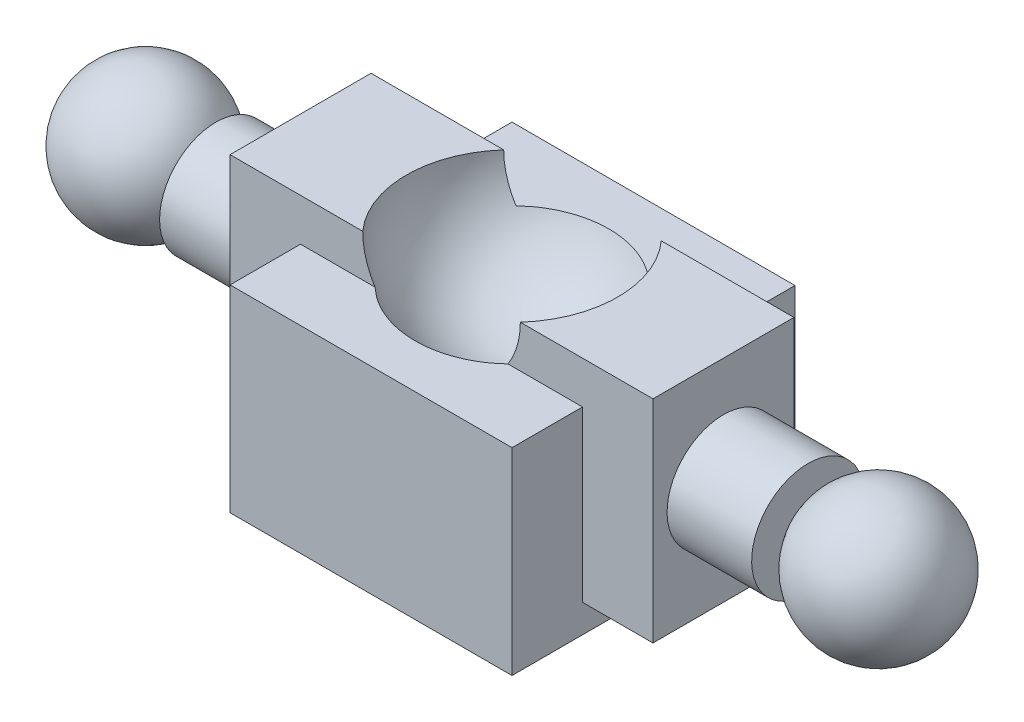
ISO-10303-21;
HEADER;
FILE_DESCRIPTION(('STEP AP214'),'2;1');
FILE_NAME('part.step','',(''),(''),'','','');
FILE_SCHEMA(('AUTOMOTIVE_DESIGN { 1 0 10303 214 1 1 1 1 }'));
ENDSEC;
DATA;
#1=APPLICATION_CONTEXT('core data for automotive mechanical design processes');
#2=APPLICATION_PROTOCOL_DEFINITION('international standard','automotive_design',2000,#1);
#3=PRODUCT_CONTEXT('',#1,'mechanical');
#4=PRODUCT('Part','Part','',(#3));
#5=PRODUCT_RELATED_PRODUCT_CATEGORY('part','',(#4));
#6=PRODUCT_DEFINITION_FORMATION('','',#4);
#7=PRODUCT_DEFINITION_CONTEXT('part definition',#1,'design');
#8=PRODUCT_DEFINITION('design','',#6,#7);
#9=PRODUCT_DEFINITION_SHAPE('','',#8);
#10=(LENGTH_UNIT() NAMED_UNIT(*) SI_UNIT(.MILLI.,.METRE.));
#11=(NAMED_UNIT(*) PLANE_ANGLE_UNIT() SI_UNIT($,.RADIAN.));
#12=(NAMED_UNIT(*) SI_UNIT($,.STERADIAN.) SOLID_ANGLE_UNIT());
#13=UNCERTAINTY_MEASURE_WITH_UNIT(LENGTH_MEASURE(1.E-05),#10,'distance_accuracy_value','');
#14=(GEOMETRIC_REPRESENTATION_CONTEXT(3) GLOBAL_UNCERTAINTY_ASSIGNED_CONTEXT((#13)) GLOBAL_UNIT_ASSIGNED_CONTEXT((#10,
#11,#12)) REPRESENTATION_CONTEXT('',''));
#15=CARTESIAN_POINT('',(0.,0.,0.));
#16=DIRECTION('',(0.,0.,1.));
#17=DIRECTION('',(1.,0.,0.));
#18=AXIS2_PLACEMENT_3D('',#15,#16,#17);
#19=CARTESIAN_POINT('',(0.,0.,10.));
#20=DIRECTION('',(0.,0.,-1.));
#21=DIRECTION('',(-1.,0.,0.));
#22=AXIS2_PLACEMENT_3D('',#19,#20,#21);
#23=PLANE('',#22);
#24=DIRECTION('',(1.,0.,0.));
#25=VECTOR('',#24,1.);
#26=CARTESIAN_POINT('',(-11.2927756653992,4.81939163498099,10.));
#27=LINE('',#26,#25);
#28=CARTESIAN_POINT('',(9.29739427835023,4.81939163498099,10.));
#29=VERTEX_POINT('',#28);
#30=CARTESIAN_POINT('',(18.7072243346008,4.81939163498099,10.));
#31=VERTEX_POINT('',#30);
#32=EDGE_CURVE('E236',#29,#31,#27,.T.);
#33=ORIENTED_EDGE('',*,*,#32,.F.);
#34=CARTESIAN_POINT('',(3.70722433460076,4.81939163498099,10.));
#35=DIRECTION('',(0.,0.,-1.));
#36=DIRECTION('',(-1.,0.,0.));
#37=AXIS2_PLACEMENT_3D('',#34,#35,#36);
#38=CIRCLE('',#37,5.59016994374948);
#39=CARTESIAN_POINT('',(8.42421490062906,1.81939163498099,10.));
#40=VERTEX_POINT('',#39);
#41=EDGE_CURVE('E333',#29,#40,#38,.T.);
#42=ORIENTED_EDGE('',*,*,#41,.T.);
#43=DIRECTION('',(1.,0.,0.));
#44=VECTOR('',#43,1.);
#45=CARTESIAN_POINT('',(-6.29277566539924,1.81939163498099,10.));
#46=LINE('',#45,#44);
#47=CARTESIAN_POINT('',(13.7072243346008,1.81939163498099,10.));
#48=VERTEX_POINT('',#47);
#49=EDGE_CURVE('E214',#40,#48,#46,.T.);
#50=ORIENTED_EDGE('',*,*,#49,.T.);
#51=DIRECTION('',(0.,-1.,0.));
#52=VECTOR('',#51,1.);
#53=CARTESIAN_POINT('',(13.7072243346008,1.81939163498099,10.));
#54=LINE('',#53,#52);
#55=CARTESIAN_POINT('',(13.7072243346008,-10.180608365019,10.));
#56=VERTEX_POINT('',#55);
#57=EDGE_CURVE('E199',#48,#56,#54,.T.);
#58=ORIENTED_EDGE('',*,*,#57,.T.);
#59=DIRECTION('',(1.,0.,0.));
#60=VECTOR('',#59,1.);
#61=CARTESIAN_POINT('',(-11.2927756653992,-10.180608365019,10.));
#62=LINE('',#61,#60);
#63=CARTESIAN_POINT('',(18.7072243346008,-10.180608365019,10.));
#64=VERTEX_POINT('',#63);
#65=EDGE_CURVE('E233',#56,#64,#62,.T.);
#66=ORIENTED_EDGE('',*,*,#65,.T.);
#67=DIRECTION('',(0.,-1.,0.));
#68=VECTOR('',#67,1.);
#69=CARTESIAN_POINT('',(18.7072243346008,4.81939163498099,10.));
#70=LINE('',#69,#68);
#71=EDGE_CURVE('E232',#31,#64,#70,.T.);
#72=ORIENTED_EDGE('',*,*,#71,.F.);
#73=EDGE_LOOP('',(#33,#42,#50,#58,#66,#72));
#74=FACE_BOUND('',#73,.T.);
#75=ADVANCED_FACE('F38',(#74),#23,.F.);
#76=CARTESIAN_POINT('',(-11.2927756653992,4.81939163498099,10.));
#77=DIRECTION('',(0.,1.,0.));
#78=DIRECTION('',(0.,0.,1.));
#79=AXIS2_PLACEMENT_3D('',#76,#77,#78);
#80=PLANE('',#79);
#81=CARTESIAN_POINT('',(3.70722433460076,4.81939163498099,5.));
#82=DIRECTION('',(0.,1.,0.));
#83=DIRECTION('',(0.,0.,1.));
#84=AXIS2_PLACEMENT_3D('',#81,#82,#83);
#85=CIRCLE('',#84,7.5);
#86=CARTESIAN_POINT('',(9.29739427835023,4.81939163498099,0.));
#87=VERTEX_POINT('',#86);
#88=EDGE_CURVE('E404',#29,#87,#85,.T.);
#89=ORIENTED_EDGE('',*,*,#88,.F.);
#90=ORIENTED_EDGE('',*,*,#32,.T.);
#91=DIRECTION('',(0.,0.,-1.));
#92=VECTOR('',#91,1.);
#93=CARTESIAN_POINT('',(18.7072243346008,4.81939163498099,10.));
#94=LINE('',#93,#92);
#95=CARTESIAN_POINT('',(18.7072243346008,4.81939163498099,0.));
#96=VERTEX_POINT('',#95);
#97=EDGE_CURVE('E258',#31,#96,#94,.T.);
#98=ORIENTED_EDGE('',*,*,#97,.T.);
#99=DIRECTION('',(1.,0.,0.));
#100=VECTOR('',#99,1.);
#101=CARTESIAN_POINT('',(-11.2927756653992,4.81939163498099,0.));
#102=LINE('',#101,#100);
#103=EDGE_CURVE('E250',#87,#96,#102,.T.);
#104=ORIENTED_EDGE('',*,*,#103,.F.);
#105=EDGE_LOOP('',(#89,#90,#98,#104));
#106=FACE_BOUND('',#105,.T.);
#107=ADVANCED_FACE('F295',(#106),#80,.T.);
#108=CARTESIAN_POINT('',(0.,0.,0.));
#109=DIRECTION('',(0.,0.,-1.));
#110=DIRECTION('',(-1.,0.,0.));
#111=AXIS2_PLACEMENT_3D('',#108,#109,#110);
#112=PLANE('',#111);
#113=CARTESIAN_POINT('',(3.70722433460076,4.81939163498099,0.));
#114=DIRECTION('',(0.,0.,-1.));
#115=DIRECTION('',(-1.,0.,0.));
#116=AXIS2_PLACEMENT_3D('',#113,#114,#115);
#117=CIRCLE('',#116,5.59016994374948);
#118=CARTESIAN_POINT('',(8.42421490062906,1.81939163498099,0.));
#119=VERTEX_POINT('',#118);
#120=EDGE_CURVE('E53',#87,#119,#117,.T.);
#121=ORIENTED_EDGE('',*,*,#120,.F.);
#122=ORIENTED_EDGE('',*,*,#103,.T.);
#123=DIRECTION('',(0.,-1.,0.));
#124=VECTOR('',#123,1.);
#125=CARTESIAN_POINT('',(18.7072243346008,4.81939163498099,0.));
#126=LINE('',#125,#124);
#127=CARTESIAN_POINT('',(18.7072243346008,-10.180608365019,0.));
#128=VERTEX_POINT('',#127);
#129=EDGE_CURVE('E246',#96,#128,#126,.T.);
#130=ORIENTED_EDGE('',*,*,#129,.T.);
#131=DIRECTION('',(1.,0.,0.));
#132=VECTOR('',#131,1.);
#133=CARTESIAN_POINT('',(-11.2927756653992,-10.180608365019,0.));
#134=LINE('',#133,#132);
#135=CARTESIAN_POINT('',(13.7819980457381,-10.180608365019,0.));
#136=VERTEX_POINT('',#135);
#137=EDGE_CURVE('E228',#136,#128,#134,.T.);
#138=ORIENTED_EDGE('',*,*,#137,.F.);
#139=DIRECTION('',(0.,1.,0.));
#140=VECTOR('',#139,1.);
#141=CARTESIAN_POINT('',(13.7819980457381,-12.180608365019,0.));
#142=LINE('',#141,#140);
#143=CARTESIAN_POINT('',(13.7819980457381,1.81939163498099,0.));
#144=VERTEX_POINT('',#143);
#145=EDGE_CURVE('E182',#136,#144,#142,.T.);
#146=ORIENTED_EDGE('',*,*,#145,.T.);
#147=DIRECTION('',(1.,0.,0.));
#148=VECTOR('',#147,1.);
#149=CARTESIAN_POINT('',(-6.29277566539924,1.81939163498099,0.));
#150=LINE('',#149,#148);
#151=EDGE_CURVE('E59',#119,#144,#150,.T.);
#152=ORIENTED_EDGE('',*,*,#151,.F.);
#153=EDGE_LOOP('',(#121,#122,#130,#138,#146,#152));
#154=FACE_BOUND('',#153,.T.);
#155=ADVANCED_FACE('F302',(#154),#112,.T.);
#156=CARTESIAN_POINT('',(-11.2927756653992,-10.180608365019,10.));
#157=DIRECTION('',(0.,1.,0.));
#158=DIRECTION('',(0.,0.,1.));
#159=AXIS2_PLACEMENT_3D('',#156,#157,#158);
#160=PLANE('',#159);
#161=DIRECTION('',(0.,0.,-1.));
#162=VECTOR('',#161,1.);
#163=CARTESIAN_POINT('',(-6.29277566539924,-10.180608365019,10.));
#164=LINE('',#163,#162);
#165=CARTESIAN_POINT('',(-6.29277566539924,-10.180608365019,10.));
#166=VERTEX_POINT('',#165);
#167=CARTESIAN_POINT('',(-6.29277566539924,-10.180608365019,0.));
#168=VERTEX_POINT('',#167);
#169=EDGE_CURVE('E351',#166,#168,#164,.T.);
#170=ORIENTED_EDGE('',*,*,#169,.F.);
#171=CARTESIAN_POINT('',(-11.2927756653992,-10.180608365019,10.));
#172=VERTEX_POINT('',#171);
#173=EDGE_CURVE('E229',#172,#166,#62,.T.);
#174=ORIENTED_EDGE('',*,*,#173,.F.);
#175=DIRECTION('',(0.,0.,-1.));
#176=VECTOR('',#175,1.);
#177=CARTESIAN_POINT('',(-11.2927756653992,-10.180608365019,10.));
#178=LINE('',#177,#176);
#179=CARTESIAN_POINT('',(-11.2927756653992,-10.180608365019,0.));
#180=VERTEX_POINT('',#179);
#181=EDGE_CURVE('E242',#172,#180,#178,.T.);
#182=ORIENTED_EDGE('',*,*,#181,.T.);
#183=EDGE_CURVE('E243',#180,#168,#134,.T.);
#184=ORIENTED_EDGE('',*,*,#183,.T.);
#185=EDGE_LOOP('',(#170,#174,#182,#184));
#186=FACE_BOUND('',#185,.T.);
#187=ADVANCED_FACE('F40',(#186),#160,.F.);
#188=DIRECTION('',(0.,0.,1.));
#189=VECTOR('',#188,1.);
#190=CARTESIAN_POINT('',(13.7072243346008,-10.180608365019,10.));
#191=LINE('',#190,#189);
#192=CARTESIAN_POINT('',(13.7072243346008,-10.180608365019,0.));
#193=VERTEX_POINT('',#192);
#194=EDGE_CURVE('E355',#193,#56,#191,.T.);
#195=ORIENTED_EDGE('',*,*,#194,.F.);
#196=EDGE_CURVE('E247',#193,#136,#134,.T.);
#197=ORIENTED_EDGE('',*,*,#196,.T.);
#198=ORIENTED_EDGE('',*,*,#137,.T.);
#199=DIRECTION('',(0.,0.,-1.));
#200=VECTOR('',#199,1.);
#201=CARTESIAN_POINT('',(18.7072243346008,-10.180608365019,10.));
#202=LINE('',#201,#200);
#203=EDGE_CURVE('E261',#64,#128,#202,.T.);
#204=ORIENTED_EDGE('',*,*,#203,.F.);
#205=ORIENTED_EDGE('',*,*,#65,.F.);
#206=EDGE_LOOP('',(#195,#197,#198,#204,#205));
#207=FACE_BOUND('',#206,.T.);
#208=ADVANCED_FACE('F318',(#207),#160,.F.);
#209=CARTESIAN_POINT('',(0.,0.,0.));
#210=DIRECTION('',(0.,0.,1.));
#211=DIRECTION('',(1.,0.,0.));
#212=AXIS2_PLACEMENT_3D('',#209,#210,#211);
#213=PLANE('',#212);
#214=ORIENTED_EDGE('',*,*,#196,.F.);
#215=DIRECTION('',(0.,1.,0.));
#216=VECTOR('',#215,1.);
#217=CARTESIAN_POINT('',(13.7072243346008,-12.180608365019,0.));
#218=LINE('',#217,#216);
#219=CARTESIAN_POINT('',(13.7072243346008,-12.180608365019,0.));
#220=VERTEX_POINT('',#219);
#221=EDGE_CURVE('E183',#220,#193,#218,.T.);
#222=ORIENTED_EDGE('',*,*,#221,.F.);
#223=DIRECTION('',(1.,0.,0.));
#224=VECTOR('',#223,1.);
#225=CARTESIAN_POINT('',(-6.29277566539924,-12.180608365019,0.));
#226=LINE('',#225,#224);
#227=CARTESIAN_POINT('',(13.7819980457381,-12.180608365019,0.));
#228=VERTEX_POINT('',#227);
#229=EDGE_CURVE('E180',#220,#228,#226,.T.);
#230=ORIENTED_EDGE('',*,*,#229,.T.);
#231=EDGE_CURVE('E177',#228,#136,#142,.T.);
#232=ORIENTED_EDGE('',*,*,#231,.T.);
#233=EDGE_LOOP('',(#214,#222,#230,#232));
#234=FACE_BOUND('',#233,.T.);
#235=ADVANCED_FACE('F311',(#234),#213,.T.);
#236=CARTESIAN_POINT('',(-6.29277566539924,1.81939163498099,10.));
#237=VERTEX_POINT('',#236);
#238=CARTESIAN_POINT('',(-1.00976623142755,1.81939163498099,10.));
#239=VERTEX_POINT('',#238);
#240=EDGE_CURVE('E215',#237,#239,#46,.T.);
#241=ORIENTED_EDGE('',*,*,#240,.T.);
#242=CARTESIAN_POINT('',(-1.88294560914872,4.81939163498099,10.));
#243=VERTEX_POINT('',#242);
#244=EDGE_CURVE('E325',#239,#243,#38,.T.);
#245=ORIENTED_EDGE('',*,*,#244,.T.);
#246=CARTESIAN_POINT('',(-11.2927756653992,4.81939163498099,10.));
#247=VERTEX_POINT('',#246);
#248=EDGE_CURVE('E237',#247,#243,#27,.T.);
#249=ORIENTED_EDGE('',*,*,#248,.F.);
#250=DIRECTION('',(0.,-1.,0.));
#251=VECTOR('',#250,1.);
#252=CARTESIAN_POINT('',(-11.2927756653992,4.81939163498099,10.));
#253=LINE('',#252,#251);
#254=EDGE_CURVE('E240',#247,#172,#253,.T.);
#255=ORIENTED_EDGE('',*,*,#254,.T.);
#256=ORIENTED_EDGE('',*,*,#173,.T.);
#257=DIRECTION('',(0.,-1.,0.));
#258=VECTOR('',#257,1.);
#259=CARTESIAN_POINT('',(-6.29277566539924,1.81939163498099,10.));
#260=LINE('',#259,#258);
#261=EDGE_CURVE('E203',#237,#166,#260,.T.);
#262=ORIENTED_EDGE('',*,*,#261,.F.);
#263=EDGE_LOOP('',(#241,#245,#249,#255,#256,#262));
#264=FACE_BOUND('',#263,.T.);
#265=ADVANCED_FACE('F298',(#264),#23,.F.);
#266=CARTESIAN_POINT('',(18.7072243346008,4.81939163498099,10.));
#267=DIRECTION('',(1.,0.,0.));
#268=DIRECTION('',(0.,1.,0.));
#269=AXIS2_PLACEMENT_3D('',#266,#267,#268);
#270=PLANE('',#269);
#271=CARTESIAN_POINT('',(18.7072243346008,-2.6514458074195,5.));
#272=DIRECTION('',(1.,0.,0.));
#273=DIRECTION('',(0.,1.,0.));
#274=AXIS2_PLACEMENT_3D('',#271,#272,#273);
#275=CIRCLE('',#274,4.);
#276=CARTESIAN_POINT('',(18.7072243346008,1.3485541925805,5.));
#277=VERTEX_POINT('',#276);
#278=EDGE_CURVE('E192',#277,#277,#275,.T.);
#279=ORIENTED_EDGE('',*,*,#278,.F.);
#280=EDGE_LOOP('',(#279));
#281=FACE_BOUND('',#280,.T.);
#282=ORIENTED_EDGE('',*,*,#129,.F.);
#283=ORIENTED_EDGE('',*,*,#97,.F.);
#284=ORIENTED_EDGE('',*,*,#71,.T.);
#285=ORIENTED_EDGE('',*,*,#203,.T.);
#286=EDGE_LOOP('',(#282,#283,#284,#285));
#287=FACE_BOUND('',#286,.T.);
#288=ADVANCED_FACE('F310',(#281,#287),#270,.T.);
#289=CARTESIAN_POINT('',(-1.88294560914872,4.81939163498099,0.));
#290=VERTEX_POINT('',#289);
#291=EDGE_CURVE('E403',#290,#243,#85,.T.);
#292=ORIENTED_EDGE('',*,*,#291,.F.);
#293=CARTESIAN_POINT('',(-11.2927756653992,4.81939163498099,0.));
#294=VERTEX_POINT('',#293);
#295=EDGE_CURVE('E170',#294,#290,#102,.T.);
#296=ORIENTED_EDGE('',*,*,#295,.F.);
#297=DIRECTION('',(0.,0.,-1.));
#298=VECTOR('',#297,1.);
#299=CARTESIAN_POINT('',(-11.2927756653992,4.81939163498099,10.));
#300=LINE('',#299,#298);
#301=EDGE_CURVE('E256',#247,#294,#300,.T.);
#302=ORIENTED_EDGE('',*,*,#301,.F.);
#303=ORIENTED_EDGE('',*,*,#248,.T.);
#304=EDGE_LOOP('',(#292,#296,#302,#303));
#305=FACE_BOUND('',#304,.T.);
#306=ADVANCED_FACE('F305',(#305),#80,.T.);
#307=CARTESIAN_POINT('',(-11.2927756653992,4.81939163498099,10.));
#308=DIRECTION('',(1.,0.,0.));
#309=DIRECTION('',(0.,0.,-1.));
#310=AXIS2_PLACEMENT_3D('',#307,#308,#309);
#311=PLANE('',#310);
#312=CARTESIAN_POINT('',(-11.2927756653992,-2.68060836501901,5.));
#313=DIRECTION('',(-1.,0.,0.));
#314=DIRECTION('',(0.,0.,1.));
#315=AXIS2_PLACEMENT_3D('',#312,#313,#314);
#316=CIRCLE('',#315,4.);
#317=CARTESIAN_POINT('',(-11.2927756653992,-2.68060836501901,9.));
#318=VERTEX_POINT('',#317);
#319=EDGE_CURVE('E343',#318,#318,#316,.T.);
#320=ORIENTED_EDGE('',*,*,#319,.F.);
#321=EDGE_LOOP('',(#320));
#322=FACE_BOUND('',#321,.T.);
#323=DIRECTION('',(0.,-1.,0.));
#324=VECTOR('',#323,1.);
#325=CARTESIAN_POINT('',(-11.2927756653992,4.81939163498099,0.));
#326=LINE('',#325,#324);
#327=EDGE_CURVE('E252',#294,#180,#326,.T.);
#328=ORIENTED_EDGE('',*,*,#327,.T.);
#329=ORIENTED_EDGE('',*,*,#181,.F.);
#330=ORIENTED_EDGE('',*,*,#254,.F.);
#331=ORIENTED_EDGE('',*,*,#301,.T.);
#332=EDGE_LOOP('',(#328,#329,#330,#331));
#333=FACE_BOUND('',#332,.T.);
#334=ADVANCED_FACE('F417',(#322,#333),#311,.F.);
#335=CARTESIAN_POINT('',(-1.00976623142755,1.81939163498099,0.));
#336=VERTEX_POINT('',#335);
#337=EDGE_CURVE('E159',#336,#290,#117,.T.);
#338=ORIENTED_EDGE('',*,*,#337,.F.);
#339=CARTESIAN_POINT('',(-6.29277566539924,1.81939163498099,0.));
#340=VERTEX_POINT('',#339);
#341=EDGE_CURVE('E167',#340,#336,#150,.T.);
#342=ORIENTED_EDGE('',*,*,#341,.F.);
#343=DIRECTION('',(0.,1.,0.));
#344=VECTOR('',#343,1.);
#345=CARTESIAN_POINT('',(-6.29277566539924,-12.180608365019,0.));
#346=LINE('',#345,#344);
#347=EDGE_CURVE('E190',#168,#340,#346,.T.);
#348=ORIENTED_EDGE('',*,*,#347,.F.);
#349=ORIENTED_EDGE('',*,*,#183,.F.);
#350=ORIENTED_EDGE('',*,*,#327,.F.);
#351=ORIENTED_EDGE('',*,*,#295,.T.);
#352=EDGE_LOOP('',(#338,#342,#348,#349,#350,#351));
#353=FACE_BOUND('',#352,.T.);
#354=ADVANCED_FACE('F165',(#353),#112,.T.);
#355=CARTESIAN_POINT('',(-6.29277566539924,-12.180608365019,15.));
#356=DIRECTION('',(0.,1.,0.));
#357=DIRECTION('',(0.,0.,1.));
#358=AXIS2_PLACEMENT_3D('',#355,#356,#357);
#359=PLANE('',#358);
#360=DIRECTION('',(0.,0.,-1.));
#361=VECTOR('',#360,1.);
#362=CARTESIAN_POINT('',(-6.29277566539924,-12.180608365019,15.));
#363=LINE('',#362,#361);
#364=CARTESIAN_POINT('',(-6.29277566539924,-12.180608365019,15.));
#365=VERTEX_POINT('',#364);
#366=CARTESIAN_POINT('',(-6.29277566539924,-12.180608365019,-5.));
#367=VERTEX_POINT('',#366);
#368=EDGE_CURVE('E211',#365,#367,#363,.T.);
#369=ORIENTED_EDGE('',*,*,#368,.T.);
#370=DIRECTION('',(1.,0.,0.));
#371=VECTOR('',#370,1.);
#372=CARTESIAN_POINT('',(-6.29277566539924,-12.180608365019,-5.));
#373=LINE('',#372,#371);
#374=CARTESIAN_POINT('',(13.7819980457381,-12.180608365019,-5.));
#375=VERTEX_POINT('',#374);
#376=EDGE_CURVE('E361',#367,#375,#373,.T.);
#377=ORIENTED_EDGE('',*,*,#376,.T.);
#378=DIRECTION('',(0.,0.,1.));
#379=VECTOR('',#378,1.);
#380=CARTESIAN_POINT('',(13.7819980457381,-12.180608365019,-5.));
#381=LINE('',#380,#379);
#382=EDGE_CURVE('E194',#375,#228,#381,.T.);
#383=ORIENTED_EDGE('',*,*,#382,.T.);
#384=ORIENTED_EDGE('',*,*,#229,.F.);
#385=DIRECTION('',(0.,0.,-1.));
#386=VECTOR('',#385,1.);
#387=CARTESIAN_POINT('',(13.7072243346008,-12.180608365019,15.));
#388=LINE('',#387,#386);
#389=CARTESIAN_POINT('',(13.7072243346008,-12.180608365019,15.));
#390=VERTEX_POINT('',#389);
#391=EDGE_CURVE('E226',#390,#220,#388,.T.);
#392=ORIENTED_EDGE('',*,*,#391,.F.);
#393=DIRECTION('',(1.,0.,0.));
#394=VECTOR('',#393,1.);
#395=CARTESIAN_POINT('',(-6.29277566539924,-12.180608365019,15.));
#396=LINE('',#395,#394);
#397=EDGE_CURVE('E200',#365,#390,#396,.T.);
#398=ORIENTED_EDGE('',*,*,#397,.F.);
#399=EDGE_LOOP('',(#369,#377,#383,#384,#392,#398));
#400=FACE_BOUND('',#399,.T.);
#401=ADVANCED_FACE('F378',(#400),#359,.F.);
#402=CARTESIAN_POINT('',(13.7072243346008,1.81939163498099,15.));
#403=DIRECTION('',(1.,0.,0.));
#404=DIRECTION('',(0.,1.,0.));
#405=AXIS2_PLACEMENT_3D('',#402,#403,#404);
#406=PLANE('',#405);
#407=ORIENTED_EDGE('',*,*,#57,.F.);
#408=DIRECTION('',(0.,0.,-1.));
#409=VECTOR('',#408,1.);
#410=CARTESIAN_POINT('',(13.7072243346008,1.81939163498099,15.));
#411=LINE('',#410,#409);
#412=CARTESIAN_POINT('',(13.7072243346008,1.81939163498099,15.));
#413=VERTEX_POINT('',#412);
#414=EDGE_CURVE('E223',#413,#48,#411,.T.);
#415=ORIENTED_EDGE('',*,*,#414,.F.);
#416=DIRECTION('',(0.,-1.,0.));
#417=VECTOR('',#416,1.);
#418=CARTESIAN_POINT('',(13.7072243346008,1.81939163498099,15.));
#419=LINE('',#418,#417);
#420=EDGE_CURVE('E202',#413,#390,#419,.T.);
#421=ORIENTED_EDGE('',*,*,#420,.T.);
#422=ORIENTED_EDGE('',*,*,#391,.T.);
#423=ORIENTED_EDGE('',*,*,#221,.T.);
#424=ORIENTED_EDGE('',*,*,#194,.T.);
#425=EDGE_LOOP('',(#407,#415,#421,#422,#423,#424));
#426=FACE_BOUND('',#425,.T.);
#427=ADVANCED_FACE('F387',(#426),#406,.T.);
#428=CARTESIAN_POINT('',(-6.29277566539924,1.81939163498099,15.));
#429=DIRECTION('',(0.,1.,0.));
#430=DIRECTION('',(0.,0.,1.));
#431=AXIS2_PLACEMENT_3D('',#428,#429,#430);
#432=PLANE('',#431);
#433=CARTESIAN_POINT('',(3.70722433460076,1.81939163498099,5.));
#434=DIRECTION('',(0.,1.,0.));
#435=DIRECTION('',(0.,0.,1.));
#436=AXIS2_PLACEMENT_3D('',#433,#434,#435);
#437=CIRCLE('',#436,6.87386354243376);
#438=EDGE_CURVE('E331',#239,#40,#437,.T.);
#439=ORIENTED_EDGE('',*,*,#438,.F.);
#440=ORIENTED_EDGE('',*,*,#240,.F.);
#441=DIRECTION('',(0.,0.,-1.));
#442=VECTOR('',#441,1.);
#443=CARTESIAN_POINT('',(-6.29277566539924,1.81939163498099,15.));
#444=LINE('',#443,#442);
#445=CARTESIAN_POINT('',(-6.29277566539924,1.81939163498099,15.));
#446=VERTEX_POINT('',#445);
#447=EDGE_CURVE('E221',#446,#237,#444,.T.);
#448=ORIENTED_EDGE('',*,*,#447,.F.);
#449=DIRECTION('',(1.,0.,0.));
#450=VECTOR('',#449,1.);
#451=CARTESIAN_POINT('',(-6.29277566539924,1.81939163498099,15.));
#452=LINE('',#451,#450);
#453=EDGE_CURVE('E206',#446,#413,#452,.T.);
#454=ORIENTED_EDGE('',*,*,#453,.T.);
#455=ORIENTED_EDGE('',*,*,#414,.T.);
#456=ORIENTED_EDGE('',*,*,#49,.F.);
#457=EDGE_LOOP('',(#439,#440,#448,#454,#455,#456));
#458=FACE_BOUND('',#457,.T.);
#459=ADVANCED_FACE('F328',(#458),#432,.T.);
#460=CARTESIAN_POINT('',(-6.29277566539924,1.81939163498099,15.));
#461=DIRECTION('',(1.,0.,0.));
#462=DIRECTION('',(0.,1.,0.));
#463=AXIS2_PLACEMENT_3D('',#460,#461,#462);
#464=PLANE('',#463);
#465=ORIENTED_EDGE('',*,*,#261,.T.);
#466=ORIENTED_EDGE('',*,*,#169,.T.);
#467=ORIENTED_EDGE('',*,*,#347,.T.);
#468=DIRECTION('',(0.,0.,1.));
#469=VECTOR('',#468,1.);
#470=CARTESIAN_POINT('',(-6.29277566539924,1.81939163498099,-5.));
#471=LINE('',#470,#469);
#472=CARTESIAN_POINT('',(-6.29277566539924,1.81939163498099,-5.));
#473=VERTEX_POINT('',#472);
#474=EDGE_CURVE('E176',#473,#340,#471,.T.);
#475=ORIENTED_EDGE('',*,*,#474,.F.);
#476=DIRECTION('',(0.,1.,0.));
#477=VECTOR('',#476,1.);
#478=CARTESIAN_POINT('',(-6.29277566539924,-12.180608365019,-5.));
#479=LINE('',#478,#477);
#480=EDGE_CURVE('E185',#367,#473,#479,.T.);
#481=ORIENTED_EDGE('',*,*,#480,.F.);
#482=ORIENTED_EDGE('',*,*,#368,.F.);
#483=DIRECTION('',(0.,-1.,0.));
#484=VECTOR('',#483,1.);
#485=CARTESIAN_POINT('',(-6.29277566539924,1.81939163498099,15.));
#486=LINE('',#485,#484);
#487=EDGE_CURVE('E209',#446,#365,#486,.T.);
#488=ORIENTED_EDGE('',*,*,#487,.F.);
#489=ORIENTED_EDGE('',*,*,#447,.T.);
#490=EDGE_LOOP('',(#465,#466,#467,#475,#481,#482,#488,#489));
#491=FACE_BOUND('',#490,.T.);
#492=ADVANCED_FACE('F371',(#491),#464,.F.);
#493=CARTESIAN_POINT('',(0.,0.,15.));
#494=DIRECTION('',(0.,0.,-1.));
#495=DIRECTION('',(-1.,0.,0.));
#496=AXIS2_PLACEMENT_3D('',#493,#494,#495);
#497=PLANE('',#496);
#498=ORIENTED_EDGE('',*,*,#397,.T.);
#499=ORIENTED_EDGE('',*,*,#420,.F.);
#500=ORIENTED_EDGE('',*,*,#453,.F.);
#501=ORIENTED_EDGE('',*,*,#487,.T.);
#502=EDGE_LOOP('',(#498,#499,#500,#501));
#503=FACE_BOUND('',#502,.T.);
#504=ADVANCED_FACE('F395',(#503),#497,.F.);
#505=CARTESIAN_POINT('',(-6.29277566539924,1.81939163498099,-5.));
#506=DIRECTION('',(0.,-1.,0.));
#507=DIRECTION('',(1.,0.,0.));
#508=AXIS2_PLACEMENT_3D('',#505,#506,#507);
#509=PLANE('',#508);
#510=ORIENTED_EDGE('',*,*,#341,.T.);
#511=CARTESIAN_POINT('',(3.70722433460076,1.81939163498099,5.));
#512=DIRECTION('',(0.,-1.,0.));
#513=DIRECTION('',(1.,0.,0.));
#514=AXIS2_PLACEMENT_3D('',#511,#512,#513);
#515=CIRCLE('',#514,6.87386354243376);
#516=EDGE_CURVE('E11',#336,#119,#515,.T.);
#517=ORIENTED_EDGE('',*,*,#516,.T.);
#518=ORIENTED_EDGE('',*,*,#151,.T.);
#519=DIRECTION('',(0.,0.,1.));
#520=VECTOR('',#519,1.);
#521=CARTESIAN_POINT('',(13.7819980457381,1.81939163498099,-5.));
#522=LINE('',#521,#520);
#523=CARTESIAN_POINT('',(13.7819980457381,1.81939163498099,-5.));
#524=VERTEX_POINT('',#523);
#525=EDGE_CURVE('E197',#524,#144,#522,.T.);
#526=ORIENTED_EDGE('',*,*,#525,.F.);
#527=DIRECTION('',(1.,0.,0.));
#528=VECTOR('',#527,1.);
#529=CARTESIAN_POINT('',(-6.29277566539924,1.81939163498099,-5.));
#530=LINE('',#529,#528);
#531=EDGE_CURVE('E189',#473,#524,#530,.T.);
#532=ORIENTED_EDGE('',*,*,#531,.F.);
#533=ORIENTED_EDGE('',*,*,#474,.T.);
#534=EDGE_LOOP('',(#510,#517,#518,#526,#532,#533));
#535=FACE_BOUND('',#534,.T.);
#536=ADVANCED_FACE('F173',(#535),#509,.F.);
#537=CARTESIAN_POINT('',(13.7819980457381,-12.180608365019,-5.));
#538=DIRECTION('',(1.,0.,0.));
#539=DIRECTION('',(0.,0.,-1.));
#540=AXIS2_PLACEMENT_3D('',#537,#538,#539);
#541=PLANE('',#540);
#542=ORIENTED_EDGE('',*,*,#231,.F.);
#543=ORIENTED_EDGE('',*,*,#382,.F.);
#544=DIRECTION('',(0.,1.,0.));
#545=VECTOR('',#544,1.);
#546=CARTESIAN_POINT('',(13.7819980457381,-12.180608365019,-5.));
#547=LINE('',#546,#545);
#548=EDGE_CURVE('E359',#375,#524,#547,.T.);
#549=ORIENTED_EDGE('',*,*,#548,.T.);
#550=ORIENTED_EDGE('',*,*,#525,.T.);
#551=ORIENTED_EDGE('',*,*,#145,.F.);
#552=EDGE_LOOP('',(#542,#543,#549,#550,#551));
#553=FACE_BOUND('',#552,.T.);
#554=ADVANCED_FACE('F376',(#553),#541,.T.);
#555=CARTESIAN_POINT('',(0.,0.,-5.));
#556=DIRECTION('',(0.,0.,1.));
#557=DIRECTION('',(1.,0.,0.));
#558=AXIS2_PLACEMENT_3D('',#555,#556,#557);
#559=PLANE('',#558);
#560=ORIENTED_EDGE('',*,*,#531,.T.);
#561=ORIENTED_EDGE('',*,*,#548,.F.);
#562=ORIENTED_EDGE('',*,*,#376,.F.);
#563=ORIENTED_EDGE('',*,*,#480,.T.);
#564=EDGE_LOOP('',(#560,#561,#562,#563));
#565=FACE_BOUND('',#564,.T.);
#566=ADVANCED_FACE('F367',(#565),#559,.F.);
#567=CARTESIAN_POINT('',(24.7072243346008,-2.65144580741949,5.));
#568=DIRECTION('',(-1.,0.,0.));
#569=DIRECTION('',(0.,-1.,0.));
#570=AXIS2_PLACEMENT_3D('',#567,#568,#569);
#571=CYLINDRICAL_SURFACE('',#570,4.);
#572=CARTESIAN_POINT('',(24.7072243346008,-2.65144580741949,5.));
#573=DIRECTION('',(1.,0.,0.));
#574=DIRECTION('',(0.,1.,0.));
#575=AXIS2_PLACEMENT_3D('',#572,#573,#574);
#576=CIRCLE('',#575,4.);
#577=CARTESIAN_POINT('',(24.7072243346008,1.34855419258051,5.));
#578=VERTEX_POINT('',#577);
#579=EDGE_CURVE('E346',#578,#578,#576,.T.);
#580=ORIENTED_EDGE('',*,*,#579,.F.);
#581=EDGE_LOOP('',(#580));
#582=FACE_BOUND('',#581,.T.);
#583=ORIENTED_EDGE('',*,*,#278,.T.);
#584=EDGE_LOOP('',(#583));
#585=FACE_BOUND('',#584,.T.);
#586=ADVANCED_FACE('F438',(#582,#585),#571,.T.);
#587=CARTESIAN_POINT('',(24.7072243346008,-2.65144580741949,5.));
#588=DIRECTION('',(1.,0.,0.));
#589=DIRECTION('',(0.,1.,0.));
#590=AXIS2_PLACEMENT_3D('',#587,#588,#589);
#591=PLANE('',#590);
#592=CARTESIAN_POINT('',(24.7072243346008,-2.65144580741949,5.));
#593=DIRECTION('',(1.,0.,0.));
#594=DIRECTION('',(0.,1.,0.));
#595=AXIS2_PLACEMENT_3D('',#592,#593,#594);
#596=CIRCLE('',#595,1.5);
#597=CARTESIAN_POINT('',(24.7072243346008,-1.15144580741949,5.));
#598=VERTEX_POINT('',#597);
#599=EDGE_CURVE('E46',#598,#598,#596,.T.);
#600=ORIENTED_EDGE('',*,*,#599,.F.);
#601=EDGE_LOOP('',(#600));
#602=FACE_BOUND('',#601,.T.);
#603=ORIENTED_EDGE('',*,*,#579,.T.);
#604=EDGE_LOOP('',(#603));
#605=FACE_BOUND('',#604,.T.);
#606=ADVANCED_FACE('F430',(#602,#605),#591,.T.);
#607=CARTESIAN_POINT('',(-17.2927756653992,-2.68060836501901,5.));
#608=DIRECTION('',(1.,0.,0.));
#609=DIRECTION('',(0.,0.,-1.));
#610=AXIS2_PLACEMENT_3D('',#607,#608,#609);
#611=CYLINDRICAL_SURFACE('',#610,4.);
#612=CARTESIAN_POINT('',(-17.2927756653992,-2.68060836501901,5.));
#613=DIRECTION('',(-1.,0.,0.));
#614=DIRECTION('',(0.,0.,1.));
#615=AXIS2_PLACEMENT_3D('',#612,#613,#614);
#616=CIRCLE('',#615,4.);
#617=CARTESIAN_POINT('',(-17.2927756653992,-2.68060836501901,9.));
#618=VERTEX_POINT('',#617);
#619=EDGE_CURVE('E271',#618,#618,#616,.T.);
#620=ORIENTED_EDGE('',*,*,#619,.F.);
#621=EDGE_LOOP('',(#620));
#622=FACE_BOUND('',#621,.T.);
#623=ORIENTED_EDGE('',*,*,#319,.T.);
#624=EDGE_LOOP('',(#623));
#625=FACE_BOUND('',#624,.T.);
#626=ADVANCED_FACE('F428',(#622,#625),#611,.T.);
#627=CARTESIAN_POINT('',(-17.2927756653992,-2.68060836501901,5.));
#628=DIRECTION('',(-1.,0.,0.));
#629=DIRECTION('',(0.,0.,1.));
#630=AXIS2_PLACEMENT_3D('',#627,#628,#629);
#631=PLANE('',#630);
#632=CARTESIAN_POINT('',(-17.2927756653992,-2.68060836501901,5.));
#633=DIRECTION('',(-1.,0.,0.));
#634=DIRECTION('',(0.,0.,1.));
#635=AXIS2_PLACEMENT_3D('',#632,#633,#634);
#636=CIRCLE('',#635,1.5);
#637=CARTESIAN_POINT('',(-17.2927756653992,-2.68060836501901,6.5));
#638=VERTEX_POINT('',#637);
#639=EDGE_CURVE('E340',#638,#638,#636,.T.);
#640=ORIENTED_EDGE('',*,*,#639,.F.);
#641=EDGE_LOOP('',(#640));
#642=FACE_BOUND('',#641,.T.);
#643=ORIENTED_EDGE('',*,*,#619,.T.);
#644=EDGE_LOOP('',(#643));
#645=FACE_BOUND('',#644,.T.);
#646=ADVANCED_FACE('F290',(#642,#645),#631,.T.);
#647=CARTESIAN_POINT('',(-22.2927756653992,-2.68060836501901,5.));
#648=DIRECTION('',(1.,0.,0.));
#649=DIRECTION('',(0.,0.,-1.));
#650=AXIS2_PLACEMENT_3D('',#647,#648,#649);
#651=CYLINDRICAL_SURFACE('',#650,1.5);
#652=CARTESIAN_POINT('',(-17.5296658376743,-3.74248906687645,3.94056176441225));
#653=CARTESIAN_POINT('',(-17.5293014670963,-3.68297652604154,3.8809173117398));
#654=CARTESIAN_POINT('',(-17.5289060335968,-3.6183836789283,3.82625535725645));
#655=CARTESIAN_POINT('',(-17.5280643821856,-3.48088299954251,3.72850796595426));
#656=CARTESIAN_POINT('',(-17.5276181036721,-3.40796524466124,3.6854365536782));
#657=CARTESIAN_POINT('',(-17.5266879343175,-3.25596086475648,3.61216668093176));
#658=CARTESIAN_POINT('',(-17.5262040615556,-3.17687720486913,3.58196207753408));
#659=CARTESIAN_POINT('',(-17.5252124502822,-3.01478311461835,3.5352678233077));
#660=CARTESIAN_POINT('',(-17.5247047177312,-2.93177366493393,3.5187747662028));
#661=CARTESIAN_POINT('',(-17.5236796293666,-2.76415398520148,3.4999556049357));
#662=CARTESIAN_POINT('',(-17.5231622724533,-2.67954357219388,3.49763112990104));
#663=CARTESIAN_POINT('',(-17.5221326638648,-2.51113018677492,3.50722027695048));
#664=CARTESIAN_POINT('',(-17.5216204123911,-2.42732724623563,3.51913445875241));
#665=CARTESIAN_POINT('',(-17.5206155703014,-2.26291221962482,3.55686323089296));
#666=CARTESIAN_POINT('',(-17.5201229794061,-2.18230008822782,3.58267762370272));
#667=CARTESIAN_POINT('',(-17.5191714117711,-2.02655399992005,3.64747394333638));
#668=CARTESIAN_POINT('',(-17.518712434963,-1.95142003186118,3.68645584336338));
#669=CARTESIAN_POINT('',(-17.5178410907179,-1.80876341631643,3.77648041475398));
#670=CARTESIAN_POINT('',(-17.5174287230159,-1.74124072553414,3.82752301750571));
#671=CARTESIAN_POINT('',(-17.5166622616541,-1.61572319046531,3.940220129572));
#672=CARTESIAN_POINT('',(-17.5163081678847,-1.55772832824401,4.00187461891078));
#673=CARTESIAN_POINT('',(-17.5156682679936,-1.45291360245205,4.13404434403629));
#674=CARTESIAN_POINT('',(-17.5153824607877,-1.40609356143684,4.20455943909868));
#675=CARTESIAN_POINT('',(-17.5148872026895,-1.32495647223387,4.35244951819859));
#676=CARTESIAN_POINT('',(-17.5146777518702,-1.29063943598888,4.42982450878854));
#677=CARTESIAN_POINT('',(-17.5143411242112,-1.23548321840679,4.58923635841066));
#678=CARTESIAN_POINT('',(-17.5142139458809,-1.21464379291188,4.67127313296155));
#679=CARTESIAN_POINT('',(-17.5140454487556,-1.18703345718911,4.83768097641921));
#680=CARTESIAN_POINT('',(-17.5140041299191,-1.18026254017607,4.92205204420014));
#681=CARTESIAN_POINT('',(-17.5140085169655,-1.18098143045953,5.09073243249492));
#682=CARTESIAN_POINT('',(-17.5140542218543,-1.18847107484272,5.17504175370316));
#683=CARTESIAN_POINT('',(-17.5142313652717,-1.21749813278249,5.34120632742934));
#684=CARTESIAN_POINT('',(-17.5143628038099,-1.23903554788788,5.42306157967672));
#685=CARTESIAN_POINT('',(-17.5147077026789,-1.29554669256196,5.58199437014427));
#686=CARTESIAN_POINT('',(-17.5149211629822,-1.33052041761302,5.65907190997084));
#687=CARTESIAN_POINT('',(-17.5154240781794,-1.41291130170859,5.80626137555449));
#688=CARTESIAN_POINT('',(-17.5157135330732,-1.46032846075797,5.87637330130884));
#689=CARTESIAN_POINT('',(-17.5163602620954,-1.56626070860066,6.00764213199235));
#690=CARTESIAN_POINT('',(-17.5167175369767,-1.62477592059594,6.06879893749533));
#691=CARTESIAN_POINT('',(-17.5174898048907,-1.75124280938915,6.18042068285877));
#692=CARTESIAN_POINT('',(-17.5179047979314,-1.81919448747654,6.2308856212582));
#693=CARTESIAN_POINT('',(-17.5187807690954,-1.96260664289569,6.31969203165389));
#694=CARTESIAN_POINT('',(-17.5192417480326,-2.03806725313049,6.35803328901893));
#695=CARTESIAN_POINT('',(-17.520196634336,-2.19435416346876,6.42150284860523));
#696=CARTESIAN_POINT('',(-17.5206905417009,-2.27518046339573,6.44663115126107));
#697=CARTESIAN_POINT('',(-17.5216972961559,-2.43990576333338,6.48296188748947));
#698=CARTESIAN_POINT('',(-17.5222101435558,-2.5238048136278,6.49416409306476));
#699=CARTESIAN_POINT('',(-17.5232402249422,-2.69229278532912,6.50232392423053));
#700=CARTESIAN_POINT('',(-17.5237574589307,-2.77688170705748,6.49928154318298));
#701=CARTESIAN_POINT('',(-17.524781631214,-2.94434890733563,6.47903845357224));
#702=CARTESIAN_POINT('',(-17.5252885694217,-3.02722717141948,6.46183762533034));
#703=CARTESIAN_POINT('',(-17.5262777387636,-3.18891954010277,6.41376574209699));
#704=CARTESIAN_POINT('',(-17.526759969924,-3.26773364900227,6.38289470156952));
#705=CARTESIAN_POINT('',(-17.5276860045268,-3.41906012112671,6.30835881877816));
#706=CARTESIAN_POINT('',(-17.5281298081313,-3.4915725109125,6.26469403044146));
#707=CARTESIAN_POINT('',(-17.5289663552764,-3.62823752368618,6.16580994798656));
#708=CARTESIAN_POINT('',(-17.5293590987284,-3.69239013215314,6.11059063379858));
#709=CARTESIAN_POINT('',(-17.5300823259598,-3.81051321773349,5.99016599712351));
#710=CARTESIAN_POINT('',(-17.5304128107394,-3.8644838584185,5.92496083508788));
#711=CARTESIAN_POINT('',(-17.5310021057738,-3.96071215993099,5.78641465461977));
#712=CARTESIAN_POINT('',(-17.5312609158917,-4.00296979836832,5.7130736206354));
#713=CARTESIAN_POINT('',(-17.5316994752535,-4.07457227358271,5.56033779633917));
#714=CARTESIAN_POINT('',(-17.5318792244702,-4.10391710589203,5.48094300393275));
#715=CARTESIAN_POINT('',(-17.5321545257332,-4.14885977648735,5.3183566178688));
#716=CARTESIAN_POINT('',(-17.5322500810926,-4.16445815570798,5.23516517374826));
#717=CARTESIAN_POINT('',(-17.5323542743098,-4.18146654657227,5.06735477673704));
#718=CARTESIAN_POINT('',(-17.5323629225092,-4.18287824636361,4.98273599489317));
#719=CARTESIAN_POINT('',(-17.5322930619614,-4.17147433298224,4.81443948132617));
#720=CARTESIAN_POINT('',(-17.5322145315537,-4.15865518400679,4.73076198869517));
#721=CARTESIAN_POINT('',(-17.5319725062738,-4.11914542514428,4.56671507164437));
#722=CARTESIAN_POINT('',(-17.5318089711971,-4.09244825140995,4.48634723200963));
#723=CARTESIAN_POINT('',(-17.5314016742291,-4.02595165388134,4.33130723184262));
#724=CARTESIAN_POINT('',(-17.5311580090824,-3.98616802992109,4.25662833605561));
#725=CARTESIAN_POINT('',(-17.5307029882179,-3.91186857571804,4.14164277893109));
#726=CARTESIAN_POINT('',(-17.530513800526,-3.88097494097607,4.09895093241625));
#727=CARTESIAN_POINT('',(-17.5301090638312,-3.81487840832987,4.01704485952761));
#728=CARTESIAN_POINT('',(-17.5298935148284,-3.77967551043053,3.97783063314987));
#729=CARTESIAN_POINT('',(-17.5296658376743,-3.74248906687645,3.94056176441225));
#730=B_SPLINE_CURVE_WITH_KNOTS('',3,(#652,#653,#654,#655,#656,#657,#658,#659,#660,#661,#662,
#663,#664,#665,#666,#667,#668,#669,#670,#671,#672,#673,#674,#675,#676,#677,#678,#679,#680,#681,
#682,#683,#684,#685,#686,#687,#688,#689,#690,#691,#692,#693,#694,#695,#696,#697,#698,#699,#700,
#701,#702,#703,#704,#705,#706,#707,#708,#709,#710,#711,#712,#713,#714,#715,#716,#717,#718,#719,
#720,#721,#722,#723,#724,#725,#726,#727,#728,#729),.UNSPECIFIED.,.T.,.F.,(4,2,2,2,2,2,2,2,2,2,2,
2,2,2,2,2,2,2,2,2,2,2,2,2,2,2,2,2,2,2,2,2,2,2,2,2,2,2,4),(0.,0.252580502046177,
0.505465265838996,0.75822916061862,1.01093024401886,1.26366038286934,1.51640045680162,
1.76913693926781,2.02187290739912,2.27460743778105,2.52734149242147,2.78007153364071,
3.03280181626518,3.28552752034812,3.53825310254248,3.79097579760563,4.04369852053214,
4.29642115848673,4.54914379654035,4.80186924028922,5.05459471857264,5.30732467072312,
5.56005461456101,5.81278869602461,6.06552289526304,6.31825923083846,6.57099529900306,
6.82373030186981,7.07646574373128,7.3291971250941,7.58192898956604,7.83466094148153,
8.0873829477355,8.34007488091129,8.59282961208689,8.84570399681461,9.09827418919833,
9.25609925364909,9.41392431792013),.UNSPECIFIED.);
#731=CARTESIAN_POINT('',(-17.5296658376743,-3.74248906687645,3.94056176441225));
#732=VERTEX_POINT('',#731);
#733=EDGE_CURVE('E264',#732,#732,#730,.T.);
#734=ORIENTED_EDGE('',*,*,#733,.T.);
#735=EDGE_LOOP('',(#734));
#736=FACE_BOUND('',#735,.T.);
#737=ORIENTED_EDGE('',*,*,#639,.T.);
#738=EDGE_LOOP('',(#737));
#739=FACE_BOUND('',#738,.T.);
#740=ADVANCED_FACE('F273',(#736,#739),#651,.T.);
#741=CARTESIAN_POINT('',(29.7072243346008,-2.65144580741949,5.));
#742=DIRECTION('',(-1.,0.,0.));
#743=DIRECTION('',(0.,-1.,0.));
#744=AXIS2_PLACEMENT_3D('',#741,#742,#743);
#745=CYLINDRICAL_SURFACE('',#744,1.5);
#746=CARTESIAN_POINT('',(24.937528327516,-2.65144580741949,5.));
#747=DIRECTION('',(1.,0.,0.));
#748=DIRECTION('',(0.,1.,0.));
#749=AXIS2_PLACEMENT_3D('',#746,#747,#748);
#750=CIRCLE('',#749,1.5);
#751=CARTESIAN_POINT('',(24.937528327516,-1.15144580741949,5.));
#752=VERTEX_POINT('',#751);
#753=EDGE_CURVE('E272',#752,#752,#750,.F.);
#754=ORIENTED_EDGE('',*,*,#753,.T.);
#755=EDGE_LOOP('',(#754));
#756=FACE_BOUND('',#755,.T.);
#757=ORIENTED_EDGE('',*,*,#599,.T.);
#758=EDGE_LOOP('',(#757));
#759=FACE_BOUND('',#758,.T.);
#760=ADVANCED_FACE('F282',(#756,#759),#745,.T.);
#761=CARTESIAN_POINT('',(-22.2927756653992,-2.6514458074195,5.));
#762=DIRECTION('',(0.,1.,0.));
#763=DIRECTION('',(0.,0.,1.));
#764=AXIS2_PLACEMENT_3D('',#761,#762,#763);
#765=SPHERICAL_SURFACE('',#764,5.);
#766=ORIENTED_EDGE('',*,*,#733,.F.);
#767=EDGE_LOOP('',(#766));
#768=FACE_BOUND('',#767,.T.);
#769=ADVANCED_FACE('F277',(#768),#765,.T.);
#770=CARTESIAN_POINT('',(29.7072243346008,-2.65144580741949,5.));
#771=DIRECTION('',(0.,1.,0.));
#772=DIRECTION('',(0.,0.,-1.));
#773=AXIS2_PLACEMENT_3D('',#770,#771,#772);
#774=SPHERICAL_SURFACE('',#773,5.);
#775=CARTESIAN_POINT('',(29.7072243346008,-2.65144580741949,5.));
#776=DIRECTION('',(1.,0.,0.));
#777=DIRECTION('',(0.,1.,0.));
#778=AXIS2_PLACEMENT_3D('',#775,#776,#777);
#779=SPHERICAL_SURFACE('',#778,5.);
#780=ORIENTED_EDGE('',*,*,#753,.F.);
#781=EDGE_LOOP('',(#780));
#782=FACE_BOUND('',#781,.T.);
#783=ADVANCED_FACE('F281',(#782),#779,.T.);
#784=CARTESIAN_POINT('',(3.70722433460076,4.81939163498099,5.));
#785=DIRECTION('',(0.,0.,-1.));
#786=DIRECTION('',(1.,0.,0.));
#787=AXIS2_PLACEMENT_3D('',#784,#785,#786);
#788=SPHERICAL_SURFACE('',#787,7.5);
#789=ORIENTED_EDGE('',*,*,#438,.T.);
#790=ORIENTED_EDGE('',*,*,#41,.F.);
#791=ORIENTED_EDGE('',*,*,#88,.T.);
#792=ORIENTED_EDGE('',*,*,#120,.T.);
#793=ORIENTED_EDGE('',*,*,#516,.F.);
#794=ORIENTED_EDGE('',*,*,#337,.T.);
#795=ORIENTED_EDGE('',*,*,#291,.T.);
#796=ORIENTED_EDGE('',*,*,#244,.F.);
#797=EDGE_LOOP('',(#789,#790,#791,#792,#793,#794,#795,#796));
#798=FACE_BOUND('',#797,.T.);
#799=ADVANCED_FACE('F158',(#798),#788,.F.);
#800=CLOSED_SHELL('',(#75,#107,#155,#187,#208,#235,#265,#288,#306,#334,#354,#401,#427,#459,#492,
#504,#536,#554,#566,#586,#606,#626,#646,#740,#760,#769,#783,#799));
#801=MANIFOLD_SOLID_BREP('B2',#800);
#802=ADVANCED_BREP_SHAPE_REPRESENTATION('',(#18,#801),#14);
#803=SHAPE_DEFINITION_REPRESENTATION(#9,#802);
ENDSEC;
END-ISO-10303-21;
